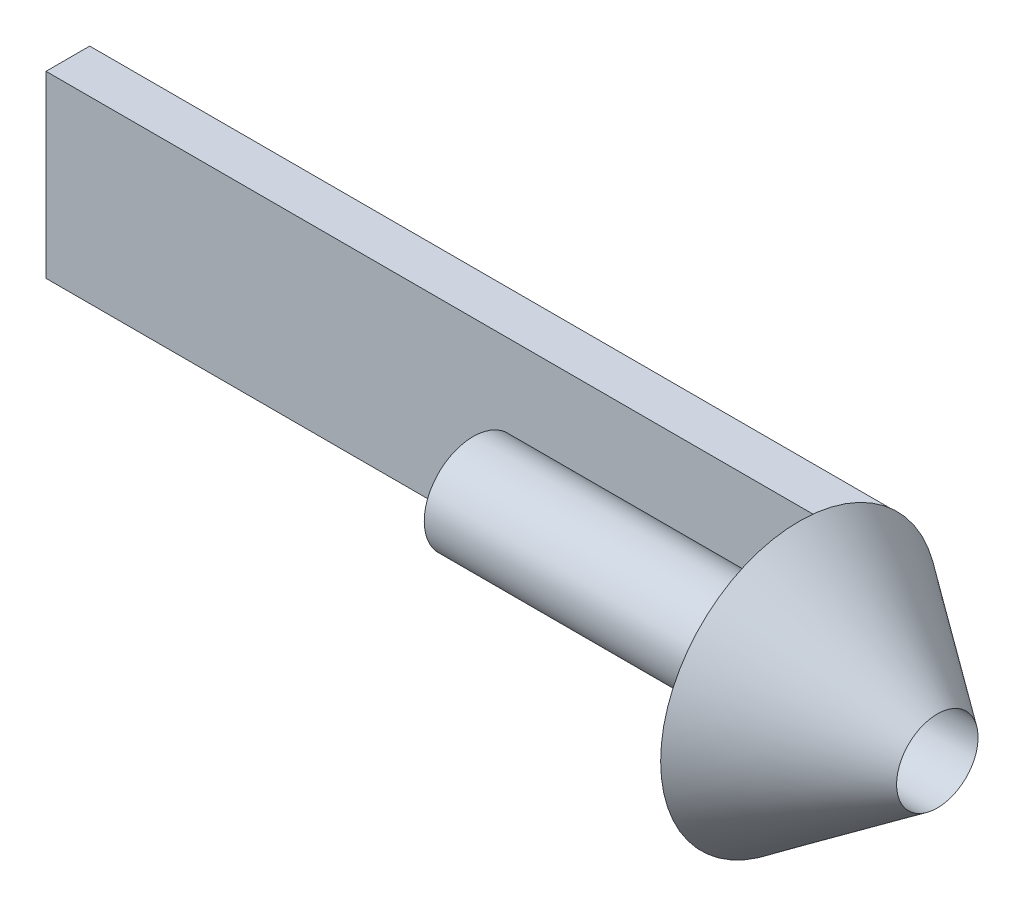
ISO-10303-21;
HEADER;
FILE_DESCRIPTION(('STEP AP214'),'2;1');
FILE_NAME('part.step','',(''),(''),'','','');
FILE_SCHEMA(('AUTOMOTIVE_DESIGN { 1 0 10303 214 1 1 1 1 }'));
ENDSEC;
DATA;
#1=APPLICATION_CONTEXT('core data for automotive mechanical design processes');
#2=APPLICATION_PROTOCOL_DEFINITION('international standard','automotive_design',2000,#1);
#3=PRODUCT_CONTEXT('',#1,'mechanical');
#4=PRODUCT('Part','Part','',(#3));
#5=PRODUCT_RELATED_PRODUCT_CATEGORY('part','',(#4));
#6=PRODUCT_DEFINITION_FORMATION('','',#4);
#7=PRODUCT_DEFINITION_CONTEXT('part definition',#1,'design');
#8=PRODUCT_DEFINITION('design','',#6,#7);
#9=PRODUCT_DEFINITION_SHAPE('','',#8);
#10=(LENGTH_UNIT() NAMED_UNIT(*) SI_UNIT(.MILLI.,.METRE.));
#11=(NAMED_UNIT(*) PLANE_ANGLE_UNIT() SI_UNIT($,.RADIAN.));
#12=(NAMED_UNIT(*) SI_UNIT($,.STERADIAN.) SOLID_ANGLE_UNIT());
#13=UNCERTAINTY_MEASURE_WITH_UNIT(LENGTH_MEASURE(1.E-05),#10,'distance_accuracy_value','');
#14=(GEOMETRIC_REPRESENTATION_CONTEXT(3) GLOBAL_UNCERTAINTY_ASSIGNED_CONTEXT((#13)) GLOBAL_UNIT_ASSIGNED_CONTEXT((#10,
#11,#12)) REPRESENTATION_CONTEXT('',''));
#15=CARTESIAN_POINT('',(0.,0.,0.));
#16=DIRECTION('',(0.,0.,1.));
#17=DIRECTION('',(1.,0.,0.));
#18=AXIS2_PLACEMENT_3D('',#15,#16,#17);
#19=CARTESIAN_POINT('',(0.,8.5,0.));
#20=DIRECTION('',(1.,0.,0.));
#21=DIRECTION('',(0.,0.,-1.));
#22=AXIS2_PLACEMENT_3D('',#19,#20,#21);
#23=PLANE('',#22);
#24=CARTESIAN_POINT('',(0.,0.,0.));
#25=DIRECTION('',(1.,0.,0.));
#26=DIRECTION('',(0.,0.,-1.));
#27=AXIS2_PLACEMENT_3D('',#24,#25,#26);
#28=CIRCLE('',#27,3.);
#29=CARTESIAN_POINT('',(0.,0.,-3.));
#30=VERTEX_POINT('',#29);
#31=EDGE_CURVE('E11',#30,#30,#28,.F.);
#32=ORIENTED_EDGE('',*,*,#31,.F.);
#33=EDGE_LOOP('',(#32));
#34=FACE_BOUND('',#33,.T.);
#35=DIRECTION('',(0.,0.,-1.));
#36=VECTOR('',#35,1.);
#37=CARTESIAN_POINT('',(0.,5.5,-6.48074069840786));
#38=LINE('',#37,#36);
#39=CARTESIAN_POINT('',(0.,5.5,-3.8));
#40=VERTEX_POINT('',#39);
#41=CARTESIAN_POINT('',(0.,5.5,-6.48074069840786));
#42=VERTEX_POINT('',#41);
#43=EDGE_CURVE('E100',#40,#42,#38,.T.);
#44=ORIENTED_EDGE('',*,*,#43,.F.);
#45=DIRECTION('',(0.,1.,0.));
#46=VECTOR('',#45,1.);
#47=CARTESIAN_POINT('',(0.,5.5,-3.8));
#48=LINE('',#47,#46);
#49=CARTESIAN_POINT('',(0.,-5.5,-3.8));
#50=VERTEX_POINT('',#49);
#51=EDGE_CURVE('E52',#50,#40,#48,.T.);
#52=ORIENTED_EDGE('',*,*,#51,.F.);
#53=DIRECTION('',(0.,0.,1.));
#54=VECTOR('',#53,1.);
#55=CARTESIAN_POINT('',(0.,-5.5,-6.48074069840786));
#56=LINE('',#55,#54);
#57=CARTESIAN_POINT('',(0.,-5.5,-6.48074069840786));
#58=VERTEX_POINT('',#57);
#59=EDGE_CURVE('E56',#58,#50,#56,.T.);
#60=ORIENTED_EDGE('',*,*,#59,.F.);
#61=CARTESIAN_POINT('',(0.,0.,0.));
#62=DIRECTION('',(-1.,0.,0.));
#63=DIRECTION('',(0.,0.,1.));
#64=AXIS2_PLACEMENT_3D('',#61,#62,#63);
#65=CIRCLE('',#64,8.5);
#66=EDGE_CURVE('E114',#58,#42,#65,.T.);
#67=ORIENTED_EDGE('',*,*,#66,.T.);
#68=EDGE_LOOP('',(#44,#52,#60,#67));
#69=FACE_BOUND('',#68,.T.);
#70=ADVANCED_FACE('F37',(#34,#69),#23,.F.);
#71=DIRECTION('',(0.,-1.,0.));
#72=VECTOR('',#71,1.);
#73=CARTESIAN_POINT('',(0.,5.5,-6.48074069840786));
#74=LINE('',#73,#72);
#75=EDGE_CURVE('E229',#42,#58,#74,.T.);
#76=ORIENTED_EDGE('',*,*,#75,.F.);
#77=EDGE_CURVE('E45',#42,#58,#65,.T.);
#78=ORIENTED_EDGE('',*,*,#77,.T.);
#79=EDGE_LOOP('',(#76,#78));
#80=FACE_BOUND('',#79,.T.);
#81=ADVANCED_FACE('F121',(#80),#23,.F.);
#82=CARTESIAN_POINT('',(12.,0.,0.));
#83=DIRECTION('',(-1.,0.,0.));
#84=DIRECTION('',(0.,0.,1.));
#85=AXIS2_PLACEMENT_3D('',#82,#83,#84);
#86=CONICAL_SURFACE('',#85,0.,0.616296937396071);
#87=CARTESIAN_POINT('',(8.47058823529412,0.,0.));
#88=DIRECTION('',(-1.,0.,0.));
#89=DIRECTION('',(0.,0.,1.));
#90=AXIS2_PLACEMENT_3D('',#87,#88,#89);
#91=CIRCLE('',#90,2.5);
#92=CARTESIAN_POINT('',(8.47058823529412,0.,2.5));
#93=VERTEX_POINT('',#92);
#94=EDGE_CURVE('E112',#93,#93,#91,.T.);
#95=ORIENTED_EDGE('',*,*,#94,.T.);
#96=EDGE_LOOP('',(#95));
#97=FACE_BOUND('',#96,.T.);
#98=ORIENTED_EDGE('',*,*,#77,.F.);
#99=ORIENTED_EDGE('',*,*,#66,.F.);
#100=EDGE_LOOP('',(#98,#99));
#101=FACE_BOUND('',#100,.T.);
#102=ADVANCED_FACE('F39',(#97,#101),#86,.T.);
#103=CARTESIAN_POINT('',(20.,0.,0.));
#104=DIRECTION('',(-1.,0.,0.));
#105=DIRECTION('',(0.,0.,1.));
#106=AXIS2_PLACEMENT_3D('',#103,#104,#105);
#107=CYLINDRICAL_SURFACE('',#106,2.5);
#108=ORIENTED_EDGE('',*,*,#94,.F.);
#109=EDGE_LOOP('',(#108));
#110=FACE_BOUND('',#109,.T.);
#111=CARTESIAN_POINT('',(-20.,0.,0.));
#112=DIRECTION('',(-1.,0.,0.));
#113=DIRECTION('',(0.,0.,1.));
#114=AXIS2_PLACEMENT_3D('',#111,#112,#113);
#115=CIRCLE('',#114,2.5);
#116=CARTESIAN_POINT('',(-20.,0.,2.5));
#117=VERTEX_POINT('',#116);
#118=EDGE_CURVE('E101',#117,#117,#115,.T.);
#119=ORIENTED_EDGE('',*,*,#118,.T.);
#120=EDGE_LOOP('',(#119));
#121=FACE_BOUND('',#120,.T.);
#122=ADVANCED_FACE('F120',(#110,#121),#107,.F.);
#123=CARTESIAN_POINT('',(-20.,0.,0.));
#124=DIRECTION('',(-1.,0.,0.));
#125=DIRECTION('',(0.,0.,1.));
#126=AXIS2_PLACEMENT_3D('',#123,#124,#125);
#127=PLANE('',#126);
#128=CARTESIAN_POINT('',(-20.,0.,0.));
#129=DIRECTION('',(-1.,0.,0.));
#130=DIRECTION('',(0.,0.,1.));
#131=AXIS2_PLACEMENT_3D('',#128,#129,#130);
#132=CIRCLE('',#131,3.);
#133=CARTESIAN_POINT('',(-20.,0.,3.));
#134=VERTEX_POINT('',#133);
#135=EDGE_CURVE('E104',#134,#134,#132,.T.);
#136=ORIENTED_EDGE('',*,*,#135,.T.);
#137=EDGE_LOOP('',(#136));
#138=FACE_BOUND('',#137,.T.);
#139=ORIENTED_EDGE('',*,*,#118,.F.);
#140=EDGE_LOOP('',(#139));
#141=FACE_BOUND('',#140,.T.);
#142=ADVANCED_FACE('F127',(#138,#141),#127,.T.);
#143=CARTESIAN_POINT('',(-20.,0.,0.));
#144=DIRECTION('',(1.,0.,0.));
#145=DIRECTION('',(0.,0.,-1.));
#146=AXIS2_PLACEMENT_3D('',#143,#144,#145);
#147=CYLINDRICAL_SURFACE('',#146,3.);
#148=ORIENTED_EDGE('',*,*,#135,.F.);
#149=EDGE_LOOP('',(#148));
#150=FACE_BOUND('',#149,.T.);
#151=ORIENTED_EDGE('',*,*,#31,.T.);
#152=EDGE_LOOP('',(#151));
#153=FACE_BOUND('',#152,.T.);
#154=ADVANCED_FACE('F136',(#150,#153),#147,.T.);
#155=CARTESIAN_POINT('',(-50.,5.5,-6.48074069840786));
#156=DIRECTION('',(0.,-1.,0.));
#157=DIRECTION('',(0.,0.,-1.));
#158=AXIS2_PLACEMENT_3D('',#155,#156,#157);
#159=PLANE('',#158);
#160=ORIENTED_EDGE('',*,*,#43,.T.);
#161=DIRECTION('',(1.,0.,0.));
#162=VECTOR('',#161,1.);
#163=CARTESIAN_POINT('',(-50.,5.5,-6.48074069840786));
#164=LINE('',#163,#162);
#165=CARTESIAN_POINT('',(-50.,5.5,-6.48074069840786));
#166=VERTEX_POINT('',#165);
#167=EDGE_CURVE('E82',#166,#42,#164,.T.);
#168=ORIENTED_EDGE('',*,*,#167,.F.);
#169=DIRECTION('',(0.,0.,-1.));
#170=VECTOR('',#169,1.);
#171=CARTESIAN_POINT('',(-50.,5.5,-6.48074069840786));
#172=LINE('',#171,#170);
#173=CARTESIAN_POINT('',(-50.,5.5,-3.8));
#174=VERTEX_POINT('',#173);
#175=EDGE_CURVE('E89',#174,#166,#172,.T.);
#176=ORIENTED_EDGE('',*,*,#175,.F.);
#177=DIRECTION('',(1.,0.,0.));
#178=VECTOR('',#177,1.);
#179=CARTESIAN_POINT('',(-50.,5.5,-3.8));
#180=LINE('',#179,#178);
#181=EDGE_CURVE('E222',#174,#40,#180,.T.);
#182=ORIENTED_EDGE('',*,*,#181,.T.);
#183=EDGE_LOOP('',(#160,#168,#176,#182));
#184=FACE_BOUND('',#183,.T.);
#185=ADVANCED_FACE('F99',(#184),#159,.F.);
#186=CARTESIAN_POINT('',(-50.,5.5,-6.48074069840786));
#187=DIRECTION('',(0.,0.,1.));
#188=DIRECTION('',(1.,0.,0.));
#189=AXIS2_PLACEMENT_3D('',#186,#187,#188);
#190=PLANE('',#189);
#191=ORIENTED_EDGE('',*,*,#75,.T.);
#192=DIRECTION('',(1.,0.,0.));
#193=VECTOR('',#192,1.);
#194=CARTESIAN_POINT('',(-50.,-5.5,-6.48074069840786));
#195=LINE('',#194,#193);
#196=CARTESIAN_POINT('',(-50.,-5.5,-6.48074069840786));
#197=VERTEX_POINT('',#196);
#198=EDGE_CURVE('E85',#197,#58,#195,.T.);
#199=ORIENTED_EDGE('',*,*,#198,.F.);
#200=DIRECTION('',(0.,-1.,0.));
#201=VECTOR('',#200,1.);
#202=CARTESIAN_POINT('',(-50.,5.5,-6.48074069840786));
#203=LINE('',#202,#201);
#204=EDGE_CURVE('E77',#166,#197,#203,.T.);
#205=ORIENTED_EDGE('',*,*,#204,.F.);
#206=ORIENTED_EDGE('',*,*,#167,.T.);
#207=EDGE_LOOP('',(#191,#199,#205,#206));
#208=FACE_BOUND('',#207,.T.);
#209=ADVANCED_FACE('F80',(#208),#190,.F.);
#210=CARTESIAN_POINT('',(-50.,-5.5,-6.48074069840786));
#211=DIRECTION('',(0.,1.,0.));
#212=DIRECTION('',(0.,0.,1.));
#213=AXIS2_PLACEMENT_3D('',#210,#211,#212);
#214=PLANE('',#213);
#215=ORIENTED_EDGE('',*,*,#59,.T.);
#216=DIRECTION('',(1.,0.,0.));
#217=VECTOR('',#216,1.);
#218=CARTESIAN_POINT('',(-50.,-5.5,-3.8));
#219=LINE('',#218,#217);
#220=CARTESIAN_POINT('',(-50.,-5.5,-3.8));
#221=VERTEX_POINT('',#220);
#222=EDGE_CURVE('E106',#221,#50,#219,.T.);
#223=ORIENTED_EDGE('',*,*,#222,.F.);
#224=DIRECTION('',(0.,0.,1.));
#225=VECTOR('',#224,1.);
#226=CARTESIAN_POINT('',(-50.,-5.5,-6.48074069840786));
#227=LINE('',#226,#225);
#228=EDGE_CURVE('E88',#197,#221,#227,.T.);
#229=ORIENTED_EDGE('',*,*,#228,.F.);
#230=ORIENTED_EDGE('',*,*,#198,.T.);
#231=EDGE_LOOP('',(#215,#223,#229,#230));
#232=FACE_BOUND('',#231,.T.);
#233=ADVANCED_FACE('F147',(#232),#214,.F.);
#234=CARTESIAN_POINT('',(-50.,5.5,-3.8));
#235=DIRECTION('',(0.,0.,-1.));
#236=DIRECTION('',(-1.,0.,0.));
#237=AXIS2_PLACEMENT_3D('',#234,#235,#236);
#238=PLANE('',#237);
#239=ORIENTED_EDGE('',*,*,#51,.T.);
#240=ORIENTED_EDGE('',*,*,#181,.F.);
#241=DIRECTION('',(0.,1.,0.));
#242=VECTOR('',#241,1.);
#243=CARTESIAN_POINT('',(-50.,5.5,-3.8));
#244=LINE('',#243,#242);
#245=EDGE_CURVE('E94',#221,#174,#244,.T.);
#246=ORIENTED_EDGE('',*,*,#245,.F.);
#247=ORIENTED_EDGE('',*,*,#222,.T.);
#248=EDGE_LOOP('',(#239,#240,#246,#247));
#249=FACE_BOUND('',#248,.T.);
#250=ADVANCED_FACE('F150',(#249),#238,.F.);
#251=CARTESIAN_POINT('',(-50.,0.,0.));
#252=DIRECTION('',(1.,0.,0.));
#253=DIRECTION('',(0.,0.,-1.));
#254=AXIS2_PLACEMENT_3D('',#251,#252,#253);
#255=PLANE('',#254);
#256=ORIENTED_EDGE('',*,*,#175,.T.);
#257=ORIENTED_EDGE('',*,*,#204,.T.);
#258=ORIENTED_EDGE('',*,*,#228,.T.);
#259=ORIENTED_EDGE('',*,*,#245,.T.);
#260=EDGE_LOOP('',(#256,#257,#258,#259));
#261=FACE_BOUND('',#260,.T.);
#262=ADVANCED_FACE('F92',(#261),#255,.F.);
#263=CLOSED_SHELL('',(#70,#81,#102,#122,#142,#154,#185,#209,#233,#250,#262));
#264=MANIFOLD_SOLID_BREP('B2',#263);
#265=ADVANCED_BREP_SHAPE_REPRESENTATION('',(#18,#264),#14);
#266=SHAPE_DEFINITION_REPRESENTATION(#9,#265);
ENDSEC;
END-ISO-10303-21;
